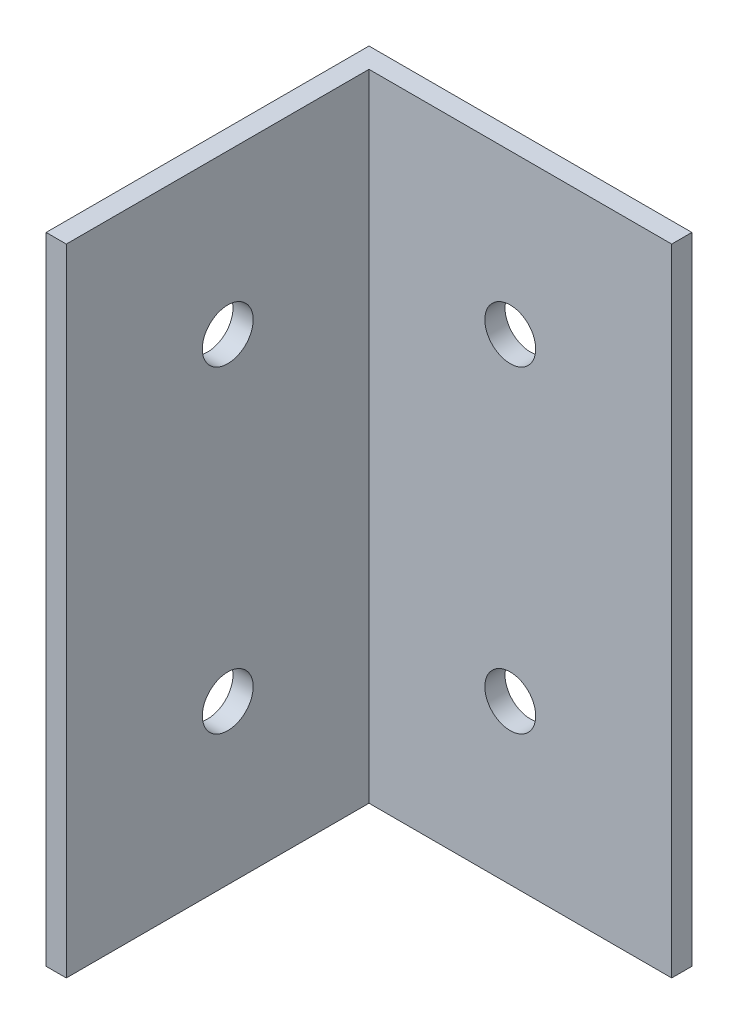
ISO-10303-21;
HEADER;
FILE_DESCRIPTION(('STEP AP214'),'2;1');
FILE_NAME('part.step','',(''),(''),'','','');
FILE_SCHEMA(('AUTOMOTIVE_DESIGN { 1 0 10303 214 1 1 1 1 }'));
ENDSEC;
DATA;
#1=APPLICATION_CONTEXT('core data for automotive mechanical design processes');
#2=APPLICATION_PROTOCOL_DEFINITION('international standard','automotive_design',2000,#1);
#3=PRODUCT_CONTEXT('',#1,'mechanical');
#4=PRODUCT('Part','Part','',(#3));
#5=PRODUCT_RELATED_PRODUCT_CATEGORY('part','',(#4));
#6=PRODUCT_DEFINITION_FORMATION('','',#4);
#7=PRODUCT_DEFINITION_CONTEXT('part definition',#1,'design');
#8=PRODUCT_DEFINITION('design','',#6,#7);
#9=PRODUCT_DEFINITION_SHAPE('','',#8);
#10=(LENGTH_UNIT() NAMED_UNIT(*) SI_UNIT(.MILLI.,.METRE.));
#11=(NAMED_UNIT(*) PLANE_ANGLE_UNIT() SI_UNIT($,.RADIAN.));
#12=(NAMED_UNIT(*) SI_UNIT($,.STERADIAN.) SOLID_ANGLE_UNIT());
#13=UNCERTAINTY_MEASURE_WITH_UNIT(LENGTH_MEASURE(1.E-05),#10,'distance_accuracy_value','');
#14=(GEOMETRIC_REPRESENTATION_CONTEXT(3) GLOBAL_UNCERTAINTY_ASSIGNED_CONTEXT((#13)) GLOBAL_UNIT_ASSIGNED_CONTEXT((#10,
#11,#12)) REPRESENTATION_CONTEXT('',''));
#15=CARTESIAN_POINT('',(0.,0.,0.));
#16=DIRECTION('',(0.,0.,1.));
#17=DIRECTION('',(1.,0.,0.));
#18=AXIS2_PLACEMENT_3D('',#15,#16,#17);
#19=CARTESIAN_POINT('',(0.,100.,0.));
#20=DIRECTION('',(1.,0.,0.));
#21=DIRECTION('',(0.,0.,-1.));
#22=AXIS2_PLACEMENT_3D('',#19,#20,#21);
#23=PLANE('',#22);
#24=CARTESIAN_POINT('',(0.,75.,25.4));
#25=DIRECTION('',(1.,0.,0.));
#26=DIRECTION('',(0.,0.,-1.));
#27=AXIS2_PLACEMENT_3D('',#24,#25,#26);
#28=CIRCLE('',#27,4.);
#29=CARTESIAN_POINT('',(0.,75.,21.4));
#30=VERTEX_POINT('',#29);
#31=EDGE_CURVE('E187',#30,#30,#28,.T.);
#32=ORIENTED_EDGE('',*,*,#31,.T.);
#33=EDGE_LOOP('',(#32));
#34=FACE_BOUND('',#33,.T.);
#35=DIRECTION('',(0.,0.,1.));
#36=VECTOR('',#35,1.);
#37=CARTESIAN_POINT('',(0.,0.,0.));
#38=LINE('',#37,#36);
#39=CARTESIAN_POINT('',(0.,0.,0.));
#40=VERTEX_POINT('',#39);
#41=CARTESIAN_POINT('',(0.,0.,50.8));
#42=VERTEX_POINT('',#41);
#43=EDGE_CURVE('E121',#40,#42,#38,.T.);
#44=ORIENTED_EDGE('',*,*,#43,.T.);
#45=DIRECTION('',(0.,-1.,0.));
#46=VECTOR('',#45,1.);
#47=CARTESIAN_POINT('',(0.,100.,50.8));
#48=LINE('',#47,#46);
#49=CARTESIAN_POINT('',(0.,100.,50.8));
#50=VERTEX_POINT('',#49);
#51=EDGE_CURVE('E41',#50,#42,#48,.T.);
#52=ORIENTED_EDGE('',*,*,#51,.F.);
#53=DIRECTION('',(0.,0.,1.));
#54=VECTOR('',#53,1.);
#55=CARTESIAN_POINT('',(0.,100.,0.));
#56=LINE('',#55,#54);
#57=CARTESIAN_POINT('',(0.,100.,0.));
#58=VERTEX_POINT('',#57);
#59=EDGE_CURVE('E86',#58,#50,#56,.T.);
#60=ORIENTED_EDGE('',*,*,#59,.F.);
#61=DIRECTION('',(0.,-1.,0.));
#62=VECTOR('',#61,1.);
#63=CARTESIAN_POINT('',(0.,100.,0.));
#64=LINE('',#63,#62);
#65=EDGE_CURVE('E11',#58,#40,#64,.T.);
#66=ORIENTED_EDGE('',*,*,#65,.T.);
#67=EDGE_LOOP('',(#44,#52,#60,#66));
#68=FACE_BOUND('',#67,.T.);
#69=CARTESIAN_POINT('',(0.,25.,25.4));
#70=DIRECTION('',(1.,0.,0.));
#71=DIRECTION('',(0.,0.,-1.));
#72=AXIS2_PLACEMENT_3D('',#69,#70,#71);
#73=CIRCLE('',#72,4.);
#74=CARTESIAN_POINT('',(0.,25.,21.4));
#75=VERTEX_POINT('',#74);
#76=EDGE_CURVE('E191',#75,#75,#73,.T.);
#77=ORIENTED_EDGE('',*,*,#76,.T.);
#78=EDGE_LOOP('',(#77));
#79=FACE_BOUND('',#78,.T.);
#80=ADVANCED_FACE('F32',(#34,#68,#79),#23,.F.);
#81=CARTESIAN_POINT('',(3.17500000000001,100.,50.8));
#82=DIRECTION('',(-1.,0.,0.));
#83=DIRECTION('',(0.,0.,1.));
#84=AXIS2_PLACEMENT_3D('',#81,#82,#83);
#85=PLANE('',#84);
#86=CARTESIAN_POINT('',(3.175,75.,25.4));
#87=DIRECTION('',(-1.,0.,0.));
#88=DIRECTION('',(0.,0.,1.));
#89=AXIS2_PLACEMENT_3D('',#86,#87,#88);
#90=CIRCLE('',#89,4.);
#91=CARTESIAN_POINT('',(3.175,75.,29.4));
#92=VERTEX_POINT('',#91);
#93=EDGE_CURVE('E188',#92,#92,#90,.T.);
#94=ORIENTED_EDGE('',*,*,#93,.T.);
#95=EDGE_LOOP('',(#94));
#96=FACE_BOUND('',#95,.T.);
#97=DIRECTION('',(0.,0.,-1.));
#98=VECTOR('',#97,1.);
#99=CARTESIAN_POINT('',(3.17500000000001,0.,50.8));
#100=LINE('',#99,#98);
#101=CARTESIAN_POINT('',(3.17500000000001,0.,50.8));
#102=VERTEX_POINT('',#101);
#103=CARTESIAN_POINT('',(3.17500000000001,0.,3.17500000000001));
#104=VERTEX_POINT('',#103);
#105=EDGE_CURVE('E108',#102,#104,#100,.T.);
#106=ORIENTED_EDGE('',*,*,#105,.T.);
#107=DIRECTION('',(0.,-1.,0.));
#108=VECTOR('',#107,1.);
#109=CARTESIAN_POINT('',(3.17500000000001,100.,3.17500000000001));
#110=LINE('',#109,#108);
#111=CARTESIAN_POINT('',(3.17500000000001,100.,3.17500000000001));
#112=VERTEX_POINT('',#111);
#113=EDGE_CURVE('E104',#112,#104,#110,.T.);
#114=ORIENTED_EDGE('',*,*,#113,.F.);
#115=DIRECTION('',(0.,0.,-1.));
#116=VECTOR('',#115,1.);
#117=CARTESIAN_POINT('',(3.17500000000001,100.,50.8));
#118=LINE('',#117,#116);
#119=CARTESIAN_POINT('',(3.17500000000001,100.,50.8));
#120=VERTEX_POINT('',#119);
#121=EDGE_CURVE('E93',#120,#112,#118,.T.);
#122=ORIENTED_EDGE('',*,*,#121,.F.);
#123=DIRECTION('',(0.,-1.,0.));
#124=VECTOR('',#123,1.);
#125=CARTESIAN_POINT('',(3.17500000000001,100.,50.8));
#126=LINE('',#125,#124);
#127=EDGE_CURVE('E109',#120,#102,#126,.T.);
#128=ORIENTED_EDGE('',*,*,#127,.T.);
#129=EDGE_LOOP('',(#106,#114,#122,#128));
#130=FACE_BOUND('',#129,.T.);
#131=CARTESIAN_POINT('',(3.175,25.,25.4));
#132=DIRECTION('',(-1.,0.,0.));
#133=DIRECTION('',(0.,0.,1.));
#134=AXIS2_PLACEMENT_3D('',#131,#132,#133);
#135=CIRCLE('',#134,4.);
#136=CARTESIAN_POINT('',(3.175,25.,29.4));
#137=VERTEX_POINT('',#136);
#138=EDGE_CURVE('E193',#137,#137,#135,.T.);
#139=ORIENTED_EDGE('',*,*,#138,.T.);
#140=EDGE_LOOP('',(#139));
#141=FACE_BOUND('',#140,.T.);
#142=ADVANCED_FACE('F105',(#96,#130,#141),#85,.F.);
#143=CARTESIAN_POINT('',(50.8,100.,0.));
#144=DIRECTION('',(0.,0.,1.));
#145=DIRECTION('',(1.,0.,0.));
#146=AXIS2_PLACEMENT_3D('',#143,#144,#145);
#147=PLANE('',#146);
#148=CARTESIAN_POINT('',(25.4,25.,0.));
#149=DIRECTION('',(0.,0.,-1.));
#150=DIRECTION('',(-1.,0.,0.));
#151=AXIS2_PLACEMENT_3D('',#148,#149,#150);
#152=CIRCLE('',#151,4.);
#153=CARTESIAN_POINT('',(21.4,25.,0.));
#154=VERTEX_POINT('',#153);
#155=EDGE_CURVE('E172',#154,#154,#152,.T.);
#156=ORIENTED_EDGE('',*,*,#155,.F.);
#157=EDGE_LOOP('',(#156));
#158=FACE_BOUND('',#157,.T.);
#159=CARTESIAN_POINT('',(25.4,75.,0.));
#160=DIRECTION('',(0.,0.,-1.));
#161=DIRECTION('',(-1.,0.,0.));
#162=AXIS2_PLACEMENT_3D('',#159,#160,#161);
#163=CIRCLE('',#162,4.);
#164=CARTESIAN_POINT('',(21.4,75.,0.));
#165=VERTEX_POINT('',#164);
#166=EDGE_CURVE('E175',#165,#165,#163,.T.);
#167=ORIENTED_EDGE('',*,*,#166,.F.);
#168=EDGE_LOOP('',(#167));
#169=FACE_BOUND('',#168,.T.);
#170=DIRECTION('',(-1.,0.,0.));
#171=VECTOR('',#170,1.);
#172=CARTESIAN_POINT('',(50.8,0.,0.));
#173=LINE('',#172,#171);
#174=CARTESIAN_POINT('',(50.8,0.,0.));
#175=VERTEX_POINT('',#174);
#176=EDGE_CURVE('E118',#175,#40,#173,.T.);
#177=ORIENTED_EDGE('',*,*,#176,.T.);
#178=ORIENTED_EDGE('',*,*,#65,.F.);
#179=DIRECTION('',(-1.,0.,0.));
#180=VECTOR('',#179,1.);
#181=CARTESIAN_POINT('',(50.8,100.,0.));
#182=LINE('',#181,#180);
#183=CARTESIAN_POINT('',(50.8,100.,0.));
#184=VERTEX_POINT('',#183);
#185=EDGE_CURVE('E129',#184,#58,#182,.T.);
#186=ORIENTED_EDGE('',*,*,#185,.F.);
#187=DIRECTION('',(0.,-1.,0.));
#188=VECTOR('',#187,1.);
#189=CARTESIAN_POINT('',(50.8,100.,0.));
#190=LINE('',#189,#188);
#191=EDGE_CURVE('E114',#184,#175,#190,.T.);
#192=ORIENTED_EDGE('',*,*,#191,.T.);
#193=EDGE_LOOP('',(#177,#178,#186,#192));
#194=FACE_BOUND('',#193,.T.);
#195=ADVANCED_FACE('F34',(#158,#169,#194),#147,.F.);
#196=CARTESIAN_POINT('',(0.,100.,50.8));
#197=DIRECTION('',(0.,0.,-1.));
#198=DIRECTION('',(-1.,0.,0.));
#199=AXIS2_PLACEMENT_3D('',#196,#197,#198);
#200=PLANE('',#199);
#201=DIRECTION('',(1.,0.,0.));
#202=VECTOR('',#201,1.);
#203=CARTESIAN_POINT('',(0.,0.,50.8));
#204=LINE('',#203,#202);
#205=EDGE_CURVE('E124',#42,#102,#204,.T.);
#206=ORIENTED_EDGE('',*,*,#205,.T.);
#207=ORIENTED_EDGE('',*,*,#127,.F.);
#208=DIRECTION('',(1.,0.,0.));
#209=VECTOR('',#208,1.);
#210=CARTESIAN_POINT('',(0.,100.,50.8));
#211=LINE('',#210,#209);
#212=EDGE_CURVE('E99',#50,#120,#211,.T.);
#213=ORIENTED_EDGE('',*,*,#212,.F.);
#214=ORIENTED_EDGE('',*,*,#51,.T.);
#215=EDGE_LOOP('',(#206,#207,#213,#214));
#216=FACE_BOUND('',#215,.T.);
#217=ADVANCED_FACE('F135',(#216),#200,.F.);
#218=CARTESIAN_POINT('',(3.17500000000001,100.,3.17500000000001));
#219=DIRECTION('',(0.,0.,-1.));
#220=DIRECTION('',(-1.,0.,0.));
#221=AXIS2_PLACEMENT_3D('',#218,#219,#220);
#222=PLANE('',#221);
#223=CARTESIAN_POINT('',(25.4,25.,3.175));
#224=DIRECTION('',(0.,0.,-1.));
#225=DIRECTION('',(-1.,0.,0.));
#226=AXIS2_PLACEMENT_3D('',#223,#224,#225);
#227=CIRCLE('',#226,4.);
#228=CARTESIAN_POINT('',(21.4,25.,3.175));
#229=VERTEX_POINT('',#228);
#230=EDGE_CURVE('E177',#229,#229,#227,.F.);
#231=ORIENTED_EDGE('',*,*,#230,.F.);
#232=EDGE_LOOP('',(#231));
#233=FACE_BOUND('',#232,.T.);
#234=CARTESIAN_POINT('',(25.4,75.,3.175));
#235=DIRECTION('',(0.,0.,-1.));
#236=DIRECTION('',(-1.,0.,0.));
#237=AXIS2_PLACEMENT_3D('',#234,#235,#236);
#238=CIRCLE('',#237,4.);
#239=CARTESIAN_POINT('',(21.4,75.,3.175));
#240=VERTEX_POINT('',#239);
#241=EDGE_CURVE('E122',#240,#240,#238,.F.);
#242=ORIENTED_EDGE('',*,*,#241,.F.);
#243=EDGE_LOOP('',(#242));
#244=FACE_BOUND('',#243,.T.);
#245=DIRECTION('',(1.,0.,0.));
#246=VECTOR('',#245,1.);
#247=CARTESIAN_POINT('',(3.17500000000001,0.,3.17500000000001));
#248=LINE('',#247,#246);
#249=CARTESIAN_POINT('',(50.8,0.,3.17500000000001));
#250=VERTEX_POINT('',#249);
#251=EDGE_CURVE('E72',#104,#250,#248,.T.);
#252=ORIENTED_EDGE('',*,*,#251,.T.);
#253=DIRECTION('',(0.,-1.,0.));
#254=VECTOR('',#253,1.);
#255=CARTESIAN_POINT('',(50.8,100.,3.17500000000001));
#256=LINE('',#255,#254);
#257=CARTESIAN_POINT('',(50.8,100.,3.17500000000001));
#258=VERTEX_POINT('',#257);
#259=EDGE_CURVE('E110',#258,#250,#256,.T.);
#260=ORIENTED_EDGE('',*,*,#259,.F.);
#261=DIRECTION('',(1.,0.,0.));
#262=VECTOR('',#261,1.);
#263=CARTESIAN_POINT('',(3.17500000000001,100.,3.17500000000001));
#264=LINE('',#263,#262);
#265=EDGE_CURVE('E97',#112,#258,#264,.T.);
#266=ORIENTED_EDGE('',*,*,#265,.F.);
#267=ORIENTED_EDGE('',*,*,#113,.T.);
#268=EDGE_LOOP('',(#252,#260,#266,#267));
#269=FACE_BOUND('',#268,.T.);
#270=ADVANCED_FACE('F112',(#233,#244,#269),#222,.F.);
#271=CARTESIAN_POINT('',(50.8,100.,3.17500000000001));
#272=DIRECTION('',(-1.,0.,0.));
#273=DIRECTION('',(0.,0.,1.));
#274=AXIS2_PLACEMENT_3D('',#271,#272,#273);
#275=PLANE('',#274);
#276=DIRECTION('',(0.,0.,-1.));
#277=VECTOR('',#276,1.);
#278=CARTESIAN_POINT('',(50.8,0.,3.17500000000001));
#279=LINE('',#278,#277);
#280=EDGE_CURVE('E78',#250,#175,#279,.T.);
#281=ORIENTED_EDGE('',*,*,#280,.T.);
#282=ORIENTED_EDGE('',*,*,#191,.F.);
#283=DIRECTION('',(0.,0.,-1.));
#284=VECTOR('',#283,1.);
#285=CARTESIAN_POINT('',(50.8,100.,3.17500000000001));
#286=LINE('',#285,#284);
#287=EDGE_CURVE('E49',#258,#184,#286,.T.);
#288=ORIENTED_EDGE('',*,*,#287,.F.);
#289=ORIENTED_EDGE('',*,*,#259,.T.);
#290=EDGE_LOOP('',(#281,#282,#288,#289));
#291=FACE_BOUND('',#290,.T.);
#292=ADVANCED_FACE('F142',(#291),#275,.F.);
#293=CARTESIAN_POINT('',(0.,100.,0.));
#294=DIRECTION('',(0.,1.,0.));
#295=DIRECTION('',(0.,0.,1.));
#296=AXIS2_PLACEMENT_3D('',#293,#294,#295);
#297=PLANE('',#296);
#298=ORIENTED_EDGE('',*,*,#185,.T.);
#299=ORIENTED_EDGE('',*,*,#59,.T.);
#300=ORIENTED_EDGE('',*,*,#212,.T.);
#301=ORIENTED_EDGE('',*,*,#121,.T.);
#302=ORIENTED_EDGE('',*,*,#265,.T.);
#303=ORIENTED_EDGE('',*,*,#287,.T.);
#304=EDGE_LOOP('',(#298,#299,#300,#301,#302,#303));
#305=FACE_BOUND('',#304,.T.);
#306=ADVANCED_FACE('F95',(#305),#297,.T.);
#307=CARTESIAN_POINT('',(0.,0.,0.));
#308=DIRECTION('',(0.,1.,0.));
#309=DIRECTION('',(0.,0.,1.));
#310=AXIS2_PLACEMENT_3D('',#307,#308,#309);
#311=PLANE('',#310);
#312=ORIENTED_EDGE('',*,*,#176,.F.);
#313=ORIENTED_EDGE('',*,*,#280,.F.);
#314=ORIENTED_EDGE('',*,*,#251,.F.);
#315=ORIENTED_EDGE('',*,*,#105,.F.);
#316=ORIENTED_EDGE('',*,*,#205,.F.);
#317=ORIENTED_EDGE('',*,*,#43,.F.);
#318=EDGE_LOOP('',(#312,#313,#314,#315,#316,#317));
#319=FACE_BOUND('',#318,.T.);
#320=ADVANCED_FACE('F138',(#319),#311,.F.);
#321=CARTESIAN_POINT('',(25.4,75.,50.801));
#322=DIRECTION('',(0.,0.,-1.));
#323=DIRECTION('',(-1.,0.,0.));
#324=AXIS2_PLACEMENT_3D('',#321,#322,#323);
#325=CYLINDRICAL_SURFACE('',#324,4.);
#326=ORIENTED_EDGE('',*,*,#166,.T.);
#327=EDGE_LOOP('',(#326));
#328=FACE_BOUND('',#327,.T.);
#329=ORIENTED_EDGE('',*,*,#241,.T.);
#330=EDGE_LOOP('',(#329));
#331=FACE_BOUND('',#330,.T.);
#332=ADVANCED_FACE('F215',(#328,#331),#325,.F.);
#333=CARTESIAN_POINT('',(25.4,25.,50.801));
#334=DIRECTION('',(0.,0.,-1.));
#335=DIRECTION('',(-1.,0.,0.));
#336=AXIS2_PLACEMENT_3D('',#333,#334,#335);
#337=CYLINDRICAL_SURFACE('',#336,4.);
#338=ORIENTED_EDGE('',*,*,#155,.T.);
#339=EDGE_LOOP('',(#338));
#340=FACE_BOUND('',#339,.T.);
#341=ORIENTED_EDGE('',*,*,#230,.T.);
#342=EDGE_LOOP('',(#341));
#343=FACE_BOUND('',#342,.T.);
#344=ADVANCED_FACE('F209',(#340,#343),#337,.F.);
#345=CARTESIAN_POINT('',(50.801,75.,25.4));
#346=DIRECTION('',(-1.,0.,0.));
#347=DIRECTION('',(0.,0.,1.));
#348=AXIS2_PLACEMENT_3D('',#345,#346,#347);
#349=CYLINDRICAL_SURFACE('',#348,4.);
#350=ORIENTED_EDGE('',*,*,#31,.F.);
#351=EDGE_LOOP('',(#350));
#352=FACE_BOUND('',#351,.T.);
#353=ORIENTED_EDGE('',*,*,#93,.F.);
#354=EDGE_LOOP('',(#353));
#355=FACE_BOUND('',#354,.T.);
#356=ADVANCED_FACE('F203',(#352,#355),#349,.F.);
#357=CARTESIAN_POINT('',(50.801,25.,25.4));
#358=DIRECTION('',(-1.,0.,0.));
#359=DIRECTION('',(0.,0.,1.));
#360=AXIS2_PLACEMENT_3D('',#357,#358,#359);
#361=CYLINDRICAL_SURFACE('',#360,4.);
#362=ORIENTED_EDGE('',*,*,#76,.F.);
#363=EDGE_LOOP('',(#362));
#364=FACE_BOUND('',#363,.T.);
#365=ORIENTED_EDGE('',*,*,#138,.F.);
#366=EDGE_LOOP('',(#365));
#367=FACE_BOUND('',#366,.T.);
#368=ADVANCED_FACE('F200',(#364,#367),#361,.F.);
#369=CLOSED_SHELL('',(#80,#142,#195,#217,#270,#292,#306,#320,#332,#344,#356,#368));
#370=MANIFOLD_SOLID_BREP('B2',#369);
#371=ADVANCED_BREP_SHAPE_REPRESENTATION('',(#18,#370),#14);
#372=SHAPE_DEFINITION_REPRESENTATION(#9,#371);
ENDSEC;
END-ISO-10303-21;
